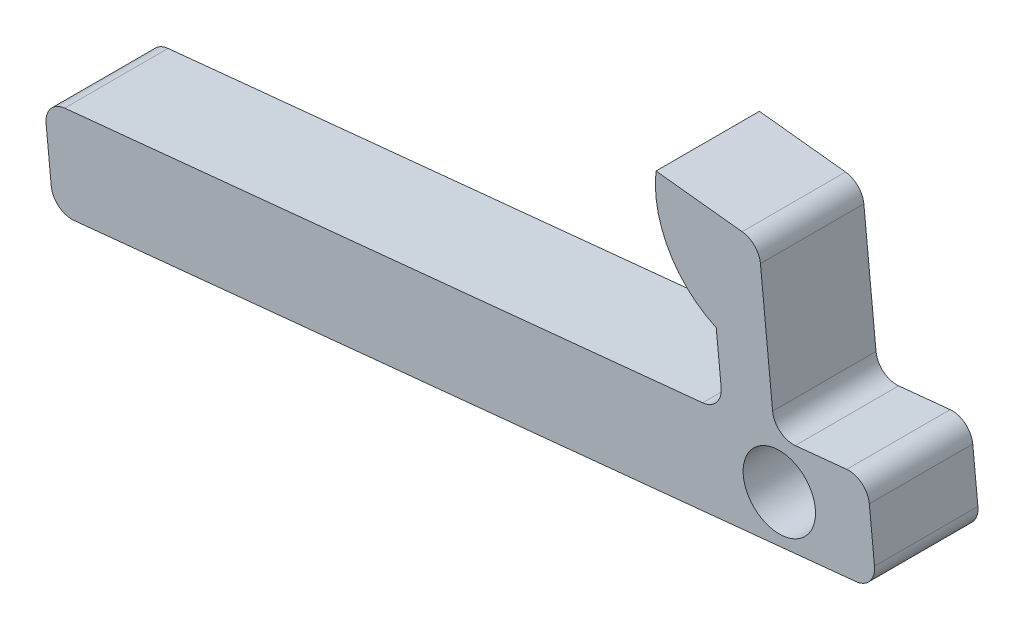
ISO-10303-21;
HEADER;
FILE_DESCRIPTION(('STEP AP214'),'2;1');
FILE_NAME('part.step','',(''),(''),'','','');
FILE_SCHEMA(('AUTOMOTIVE_DESIGN { 1 0 10303 214 1 1 1 1 }'));
ENDSEC;
DATA;
#1=APPLICATION_CONTEXT('core data for automotive mechanical design processes');
#2=APPLICATION_PROTOCOL_DEFINITION('international standard','automotive_design',2000,#1);
#3=PRODUCT_CONTEXT('',#1,'mechanical');
#4=PRODUCT('Part','Part','',(#3));
#5=PRODUCT_RELATED_PRODUCT_CATEGORY('part','',(#4));
#6=PRODUCT_DEFINITION_FORMATION('','',#4);
#7=PRODUCT_DEFINITION_CONTEXT('part definition',#1,'design');
#8=PRODUCT_DEFINITION('design','',#6,#7);
#9=PRODUCT_DEFINITION_SHAPE('','',#8);
#10=(LENGTH_UNIT() NAMED_UNIT(*) SI_UNIT(.MILLI.,.METRE.));
#11=(NAMED_UNIT(*) PLANE_ANGLE_UNIT() SI_UNIT($,.RADIAN.));
#12=(NAMED_UNIT(*) SI_UNIT($,.STERADIAN.) SOLID_ANGLE_UNIT());
#13=UNCERTAINTY_MEASURE_WITH_UNIT(LENGTH_MEASURE(1.E-05),#10,'distance_accuracy_value','');
#14=(GEOMETRIC_REPRESENTATION_CONTEXT(3) GLOBAL_UNCERTAINTY_ASSIGNED_CONTEXT((#13)) GLOBAL_UNIT_ASSIGNED_CONTEXT((#10,
#11,#12)) REPRESENTATION_CONTEXT('',''));
#15=CARTESIAN_POINT('',(0.,0.,0.));
#16=DIRECTION('',(0.,0.,1.));
#17=DIRECTION('',(1.,0.,0.));
#18=AXIS2_PLACEMENT_3D('',#15,#16,#17);
#19=CARTESIAN_POINT('',(56.2046901108476,51.9259083552137,10.));
#20=DIRECTION('',(0.,0.,1.));
#21=DIRECTION('',(1.,0.,0.));
#22=AXIS2_PLACEMENT_3D('',#19,#20,#21);
#23=PLANE('',#22);
#24=DIRECTION('',(0.0995037190210134,-0.995037190209988,0.));
#25=VECTOR('',#24,1.);
#26=CARTESIAN_POINT('',(-12.9065685656067,29.4973260201751,10.));
#27=LINE('',#26,#25);
#28=CARTESIAN_POINT('',(-12.7075611275646,27.5072516397551,10.));
#29=VERTEX_POINT('',#28);
#30=CARTESIAN_POINT('',(-12.2100425324596,22.5320656887051,10.));
#31=VERTEX_POINT('',#30);
#32=EDGE_CURVE('E252',#29,#31,#27,.T.);
#33=ORIENTED_EDGE('',*,*,#32,.T.);
#34=CARTESIAN_POINT('',(-10.2199681520396,22.7310731267472,10.));
#35=DIRECTION('',(0.,0.,1.));
#36=DIRECTION('',(1.,0.,0.));
#37=AXIS2_PLACEMENT_3D('',#34,#35,#36);
#38=CIRCLE('',#37,2.);
#39=CARTESIAN_POINT('',(-10.0209607139976,20.7409987463272,10.));
#40=VERTEX_POINT('',#39);
#41=EDGE_CURVE('E50',#31,#40,#38,.T.);
#42=ORIENTED_EDGE('',*,*,#41,.T.);
#43=DIRECTION('',(0.995037190209988,0.0995037190210137,0.));
#44=VECTOR('',#43,1.);
#45=CARTESIAN_POINT('',(-12.0110350944175,20.5419913082852,10.));
#46=LINE('',#45,#44);
#47=CARTESIAN_POINT('',(65.6018657419615,28.3032813919242,10.));
#48=VERTEX_POINT('',#47);
#49=EDGE_CURVE('E249',#40,#48,#46,.T.);
#50=ORIENTED_EDGE('',*,*,#49,.T.);
#51=CARTESIAN_POINT('',(65.4028583039195,30.2933557723442,10.));
#52=DIRECTION('',(0.,0.,1.));
#53=DIRECTION('',(1.,0.,0.));
#54=AXIS2_PLACEMENT_3D('',#51,#52,#53);
#55=CIRCLE('',#54,2.);
#56=CARTESIAN_POINT('',(67.3929326843394,30.4923632103862,10.));
#57=VERTEX_POINT('',#56);
#58=EDGE_CURVE('E206',#48,#57,#55,.T.);
#59=ORIENTED_EDGE('',*,*,#58,.T.);
#60=DIRECTION('',(-0.0995037190210138,0.995037190209988,0.));
#61=VECTOR('',#60,1.);
#62=CARTESIAN_POINT('',(66.6964066511923,37.4576235418561,10.));
#63=LINE('',#62,#61);
#64=CARTESIAN_POINT('',(66.8954140892344,35.4675491614361,10.));
#65=VERTEX_POINT('',#64);
#66=EDGE_CURVE('E258',#57,#65,#63,.T.);
#67=ORIENTED_EDGE('',*,*,#66,.T.);
#68=CARTESIAN_POINT('',(64.9053397088144,35.2685417233941,10.));
#69=DIRECTION('',(0.,0.,1.));
#70=DIRECTION('',(1.,0.,0.));
#71=AXIS2_PLACEMENT_3D('',#68,#69,#70);
#72=CIRCLE('',#71,2.);
#73=CARTESIAN_POINT('',(64.7063322707724,37.2586161038141,10.));
#74=VERTEX_POINT('',#73);
#75=EDGE_CURVE('E207',#65,#74,#72,.T.);
#76=ORIENTED_EDGE('',*,*,#75,.T.);
#77=DIRECTION('',(-0.995037190209988,-0.0995037190210148,0.));
#78=VECTOR('',#77,1.);
#79=CARTESIAN_POINT('',(57.7410719393025,36.562090070667,10.));
#80=LINE('',#79,#78);
#81=CARTESIAN_POINT('',(59.7311463197224,36.761097508709,10.));
#82=VERTEX_POINT('',#81);
#83=EDGE_CURVE('E296',#74,#82,#80,.T.);
#84=ORIENTED_EDGE('',*,*,#83,.T.);
#85=CARTESIAN_POINT('',(59.5321388816804,38.751171889129,10.));
#86=DIRECTION('',(0.,0.,1.));
#87=DIRECTION('',(1.,0.,0.));
#88=AXIS2_PLACEMENT_3D('',#85,#86,#87);
#89=CIRCLE('',#88,2.);
#90=CARTESIAN_POINT('',(57.5420645012604,38.5521644510869,10.));
#91=VERTEX_POINT('',#90);
#92=EDGE_CURVE('E230',#82,#91,#89,.F.);
#93=ORIENTED_EDGE('',*,*,#92,.T.);
#94=DIRECTION('',(-0.0995037190210135,0.995037190209988,0.));
#95=VECTOR('',#94,1.);
#96=CARTESIAN_POINT('',(57.7410719393025,36.562090070667,10.));
#97=LINE('',#96,#95);
#98=CARTESIAN_POINT('',(56.3658651346012,50.3141581176775,10.));
#99=VERTEX_POINT('',#98);
#100=EDGE_CURVE('E294',#91,#99,#97,.T.);
#101=ORIENTED_EDGE('',*,*,#100,.T.);
#102=CARTESIAN_POINT('',(54.3757907541812,50.1151506796355,10.));
#103=DIRECTION('',(0.,0.,1.));
#104=DIRECTION('',(1.,0.,0.));
#105=AXIS2_PLACEMENT_3D('',#102,#103,#104);
#106=CIRCLE('',#105,2.);
#107=CARTESIAN_POINT('',(54.5946266554137,52.1031423416733,10.));
#108=VERTEX_POINT('',#107);
#109=EDGE_CURVE('E201',#99,#108,#106,.T.);
#110=ORIENTED_EDGE('',*,*,#109,.T.);
#111=DIRECTION('',(-0.993995831018897,0.109417950616217,0.));
#112=VECTOR('',#111,1.);
#113=CARTESIAN_POINT('',(56.2046901108476,51.9259083552137,10.));
#114=LINE('',#113,#112);
#115=CARTESIAN_POINT('',(46.2647318006586,53.0200878613759,10.));
#116=VERTEX_POINT('',#115);
#117=EDGE_CURVE('E171',#108,#116,#114,.T.);
#118=ORIENTED_EDGE('',*,*,#117,.T.);
#119=CARTESIAN_POINT('',(56.2046901108476,51.9259083552137,10.));
#120=DIRECTION('',(0.,0.,1.));
#121=DIRECTION('',(1.,0.,0.));
#122=AXIS2_PLACEMENT_3D('',#119,#120,#121);
#123=CIRCLE('',#122,10.);
#124=CARTESIAN_POINT('',(52.0912316442299,42.8111149157873,10.));
#125=VERTEX_POINT('',#124);
#126=EDGE_CURVE('E168',#116,#125,#123,.T.);
#127=ORIENTED_EDGE('',*,*,#126,.T.);
#128=DIRECTION('',(0.0995037190210143,-0.995037190209988,0.));
#129=VECTOR('',#128,1.);
#130=CARTESIAN_POINT('',(52.7658859882525,36.0645714755619,10.));
#131=LINE('',#130,#129);
#132=CARTESIAN_POINT('',(52.5668785502105,38.0546458559819,10.));
#133=VERTEX_POINT('',#132);
#134=EDGE_CURVE('E151',#125,#133,#131,.T.);
#135=ORIENTED_EDGE('',*,*,#134,.T.);
#136=CARTESIAN_POINT('',(50.5768041697905,37.8556384179399,10.));
#137=DIRECTION('',(0.,0.,1.));
#138=DIRECTION('',(1.,0.,0.));
#139=AXIS2_PLACEMENT_3D('',#136,#137,#138);
#140=CIRCLE('',#139,2.);
#141=CARTESIAN_POINT('',(50.7758116078325,35.8655640375199,10.));
#142=VERTEX_POINT('',#141);
#143=EDGE_CURVE('E224',#133,#142,#140,.F.);
#144=ORIENTED_EDGE('',*,*,#143,.T.);
#145=DIRECTION('',(-0.995037190209988,-0.0995037190210135,0.));
#146=VECTOR('',#145,1.);
#147=CARTESIAN_POINT('',(-12.9065685656067,29.4973260201751,10.));
#148=LINE('',#147,#146);
#149=CARTESIAN_POINT('',(-10.9164941851867,29.6963334582171,10.));
#150=VERTEX_POINT('',#149);
#151=EDGE_CURVE('E164',#142,#150,#148,.T.);
#152=ORIENTED_EDGE('',*,*,#151,.T.);
#153=CARTESIAN_POINT('',(-10.7174867471447,27.7062590777971,10.));
#154=DIRECTION('',(0.,0.,1.));
#155=DIRECTION('',(1.,0.,0.));
#156=AXIS2_PLACEMENT_3D('',#153,#154,#155);
#157=CIRCLE('',#156,2.);
#158=EDGE_CURVE('E250',#150,#29,#157,.T.);
#159=ORIENTED_EDGE('',*,*,#158,.T.);
#160=EDGE_LOOP('',(#33,#42,#50,#59,#67,#76,#84,#93,#101,#110,#118,#127,#135,#144,#152,#159));
#161=FACE_BOUND('',#160,.T.);
#162=CARTESIAN_POINT('',(58.188838674897,32.0844227147221,10.));
#163=DIRECTION('',(0.,0.,1.));
#164=DIRECTION('',(1.,0.,0.));
#165=AXIS2_PLACEMENT_3D('',#162,#163,#164);
#166=CIRCLE('',#165,3.5);
#167=CARTESIAN_POINT('',(61.688838674897,32.0844227147221,10.));
#168=VERTEX_POINT('',#167);
#169=EDGE_CURVE('E287',#168,#168,#166,.T.);
#170=ORIENTED_EDGE('',*,*,#169,.F.);
#171=EDGE_LOOP('',(#170));
#172=FACE_BOUND('',#171,.T.);
#173=ADVANCED_FACE('F39',(#161,#172),#23,.T.);
#174=CARTESIAN_POINT('',(56.2046901108476,51.9259083552137,0.));
#175=DIRECTION('',(0.,0.,1.));
#176=DIRECTION('',(1.,0.,0.));
#177=AXIS2_PLACEMENT_3D('',#174,#175,#176);
#178=PLANE('',#177);
#179=DIRECTION('',(0.995037190209988,0.0995037190210139,0.));
#180=VECTOR('',#179,1.);
#181=CARTESIAN_POINT('',(58.6366054104913,27.6067553587771,0.));
#182=LINE('',#181,#180);
#183=CARTESIAN_POINT('',(-10.0209607139976,20.7409987463272,0.));
#184=VERTEX_POINT('',#183);
#185=CARTESIAN_POINT('',(65.6018657419615,28.3032813919242,0.));
#186=VERTEX_POINT('',#185);
#187=EDGE_CURVE('E270',#184,#186,#182,.T.);
#188=ORIENTED_EDGE('',*,*,#187,.F.);
#189=CARTESIAN_POINT('',(-10.2199681520396,22.7310731267472,0.));
#190=DIRECTION('',(0.,0.,1.));
#191=DIRECTION('',(1.,0.,0.));
#192=AXIS2_PLACEMENT_3D('',#189,#190,#191);
#193=CIRCLE('',#192,2.);
#194=CARTESIAN_POINT('',(-12.2100425324596,22.5320656887051,0.));
#195=VERTEX_POINT('',#194);
#196=EDGE_CURVE('E241',#184,#195,#193,.F.);
#197=ORIENTED_EDGE('',*,*,#196,.T.);
#198=DIRECTION('',(0.0995037190210134,-0.995037190209988,0.));
#199=VECTOR('',#198,1.);
#200=CARTESIAN_POINT('',(-12.9065685656067,29.4973260201751,0.));
#201=LINE('',#200,#199);
#202=CARTESIAN_POINT('',(-12.7075611275646,27.5072516397551,0.));
#203=VERTEX_POINT('',#202);
#204=EDGE_CURVE('E267',#203,#195,#201,.T.);
#205=ORIENTED_EDGE('',*,*,#204,.F.);
#206=CARTESIAN_POINT('',(-10.7174867471447,27.7062590777971,0.));
#207=DIRECTION('',(0.,0.,1.));
#208=DIRECTION('',(1.,0.,0.));
#209=AXIS2_PLACEMENT_3D('',#206,#207,#208);
#210=CIRCLE('',#209,2.);
#211=CARTESIAN_POINT('',(-10.9164941851867,29.6963334582171,0.));
#212=VERTEX_POINT('',#211);
#213=EDGE_CURVE('E237',#203,#212,#210,.F.);
#214=ORIENTED_EDGE('',*,*,#213,.T.);
#215=DIRECTION('',(-0.995037190209988,-0.0995037190210135,0.));
#216=VECTOR('',#215,1.);
#217=CARTESIAN_POINT('',(-12.9065685656067,29.4973260201751,0.));
#218=LINE('',#217,#216);
#219=CARTESIAN_POINT('',(50.7758116078325,35.8655640375199,0.));
#220=VERTEX_POINT('',#219);
#221=EDGE_CURVE('E268',#220,#212,#218,.T.);
#222=ORIENTED_EDGE('',*,*,#221,.F.);
#223=CARTESIAN_POINT('',(50.5768041697905,37.8556384179399,0.));
#224=DIRECTION('',(0.,0.,1.));
#225=DIRECTION('',(1.,0.,0.));
#226=AXIS2_PLACEMENT_3D('',#223,#224,#225);
#227=CIRCLE('',#226,2.);
#228=CARTESIAN_POINT('',(52.5668785502105,38.0546458559819,0.));
#229=VERTEX_POINT('',#228);
#230=EDGE_CURVE('E223',#220,#229,#227,.T.);
#231=ORIENTED_EDGE('',*,*,#230,.T.);
#232=DIRECTION('',(0.0995037190210143,-0.995037190209988,0.));
#233=VECTOR('',#232,1.);
#234=CARTESIAN_POINT('',(52.7658859882525,36.0645714755619,0.));
#235=LINE('',#234,#233);
#236=CARTESIAN_POINT('',(52.0912316442299,42.8111149157873,0.));
#237=VERTEX_POINT('',#236);
#238=EDGE_CURVE('E274',#237,#229,#235,.T.);
#239=ORIENTED_EDGE('',*,*,#238,.F.);
#240=CARTESIAN_POINT('',(56.2046901108476,51.9259083552137,0.));
#241=DIRECTION('',(0.,0.,1.));
#242=DIRECTION('',(1.,0.,0.));
#243=AXIS2_PLACEMENT_3D('',#240,#241,#242);
#244=CIRCLE('',#243,10.);
#245=CARTESIAN_POINT('',(46.2647318006586,53.0200878613759,0.));
#246=VERTEX_POINT('',#245);
#247=EDGE_CURVE('E177',#246,#237,#244,.T.);
#248=ORIENTED_EDGE('',*,*,#247,.F.);
#249=DIRECTION('',(-0.993995831018897,0.109417950616217,0.));
#250=VECTOR('',#249,1.);
#251=CARTESIAN_POINT('',(56.2046901108476,51.9259083552137,0.));
#252=LINE('',#251,#250);
#253=CARTESIAN_POINT('',(54.5946266554137,52.1031423416733,0.));
#254=VERTEX_POINT('',#253);
#255=EDGE_CURVE('E174',#254,#246,#252,.T.);
#256=ORIENTED_EDGE('',*,*,#255,.F.);
#257=CARTESIAN_POINT('',(54.3757907541812,50.1151506796355,0.));
#258=DIRECTION('',(0.,0.,1.));
#259=DIRECTION('',(1.,0.,0.));
#260=AXIS2_PLACEMENT_3D('',#257,#258,#259);
#261=CIRCLE('',#260,2.);
#262=CARTESIAN_POINT('',(56.3658651346012,50.3141581176775,0.));
#263=VERTEX_POINT('',#262);
#264=EDGE_CURVE('E193',#254,#263,#261,.F.);
#265=ORIENTED_EDGE('',*,*,#264,.T.);
#266=DIRECTION('',(-0.0995037190210135,0.995037190209988,0.));
#267=VECTOR('',#266,1.);
#268=CARTESIAN_POINT('',(57.7410719393025,36.562090070667,0.));
#269=LINE('',#268,#267);
#270=CARTESIAN_POINT('',(57.5420645012604,38.5521644510869,0.));
#271=VERTEX_POINT('',#270);
#272=EDGE_CURVE('E284',#271,#263,#269,.T.);
#273=ORIENTED_EDGE('',*,*,#272,.F.);
#274=CARTESIAN_POINT('',(59.5321388816804,38.751171889129,0.));
#275=DIRECTION('',(0.,0.,1.));
#276=DIRECTION('',(1.,0.,0.));
#277=AXIS2_PLACEMENT_3D('',#274,#275,#276);
#278=CIRCLE('',#277,2.);
#279=CARTESIAN_POINT('',(59.7311463197224,36.761097508709,0.));
#280=VERTEX_POINT('',#279);
#281=EDGE_CURVE('E227',#271,#280,#278,.T.);
#282=ORIENTED_EDGE('',*,*,#281,.T.);
#283=DIRECTION('',(-0.995037190209988,-0.0995037190210148,0.));
#284=VECTOR('',#283,1.);
#285=CARTESIAN_POINT('',(57.7410719393025,36.562090070667,0.));
#286=LINE('',#285,#284);
#287=CARTESIAN_POINT('',(64.7063322707724,37.2586161038141,0.));
#288=VERTEX_POINT('',#287);
#289=EDGE_CURVE('E277',#288,#280,#286,.T.);
#290=ORIENTED_EDGE('',*,*,#289,.F.);
#291=CARTESIAN_POINT('',(64.9053397088144,35.2685417233941,0.));
#292=DIRECTION('',(0.,0.,1.));
#293=DIRECTION('',(1.,0.,0.));
#294=AXIS2_PLACEMENT_3D('',#291,#292,#293);
#295=CIRCLE('',#294,2.);
#296=CARTESIAN_POINT('',(66.8954140892344,35.4675491614361,0.));
#297=VERTEX_POINT('',#296);
#298=EDGE_CURVE('E197',#288,#297,#295,.F.);
#299=ORIENTED_EDGE('',*,*,#298,.T.);
#300=DIRECTION('',(-0.0995037190210138,0.995037190209988,0.));
#301=VECTOR('',#300,1.);
#302=CARTESIAN_POINT('',(66.6964066511923,37.4576235418561,0.));
#303=LINE('',#302,#301);
#304=CARTESIAN_POINT('',(67.3929326843394,30.4923632103862,0.));
#305=VERTEX_POINT('',#304);
#306=EDGE_CURVE('E275',#305,#297,#303,.T.);
#307=ORIENTED_EDGE('',*,*,#306,.F.);
#308=CARTESIAN_POINT('',(65.4028583039195,30.2933557723442,0.));
#309=DIRECTION('',(0.,0.,1.));
#310=DIRECTION('',(1.,0.,0.));
#311=AXIS2_PLACEMENT_3D('',#308,#309,#310);
#312=CIRCLE('',#311,2.);
#313=EDGE_CURVE('E199',#305,#186,#312,.F.);
#314=ORIENTED_EDGE('',*,*,#313,.T.);
#315=EDGE_LOOP('',(#188,#197,#205,#214,#222,#231,#239,#248,#256,#265,#273,#282,#290,#299,#307,#314));
#316=FACE_BOUND('',#315,.T.);
#317=CARTESIAN_POINT('',(58.188838674897,32.0844227147221,0.));
#318=DIRECTION('',(0.,0.,1.));
#319=DIRECTION('',(1.,0.,0.));
#320=AXIS2_PLACEMENT_3D('',#317,#318,#319);
#321=CIRCLE('',#320,3.5);
#322=CARTESIAN_POINT('',(61.688838674897,32.0844227147221,0.));
#323=VERTEX_POINT('',#322);
#324=EDGE_CURVE('E232',#323,#323,#321,.T.);
#325=ORIENTED_EDGE('',*,*,#324,.T.);
#326=EDGE_LOOP('',(#325));
#327=FACE_BOUND('',#326,.T.);
#328=ADVANCED_FACE('F261',(#316,#327),#178,.F.);
#329=CARTESIAN_POINT('',(56.2046901108476,51.9259083552137,10.));
#330=DIRECTION('',(0.,0.,-1.));
#331=DIRECTION('',(-1.,0.,0.));
#332=AXIS2_PLACEMENT_3D('',#329,#330,#331);
#333=CYLINDRICAL_SURFACE('',#332,10.);
#334=ORIENTED_EDGE('',*,*,#247,.T.);
#335=DIRECTION('',(0.,0.,-1.));
#336=VECTOR('',#335,1.);
#337=CARTESIAN_POINT('',(52.0912316442299,42.8111149157873,10.));
#338=LINE('',#337,#336);
#339=EDGE_CURVE('E157',#125,#237,#338,.T.);
#340=ORIENTED_EDGE('',*,*,#339,.F.);
#341=ORIENTED_EDGE('',*,*,#126,.F.);
#342=DIRECTION('',(0.,0.,-1.));
#343=VECTOR('',#342,1.);
#344=CARTESIAN_POINT('',(46.2647318006586,53.0200878613759,10.));
#345=LINE('',#344,#343);
#346=EDGE_CURVE('E181',#116,#246,#345,.T.);
#347=ORIENTED_EDGE('',*,*,#346,.T.);
#348=EDGE_LOOP('',(#334,#340,#341,#347));
#349=FACE_BOUND('',#348,.T.);
#350=ADVANCED_FACE('F180',(#349),#333,.T.);
#351=CARTESIAN_POINT('',(52.7658859882525,36.0645714755619,10.));
#352=DIRECTION('',(0.995037190209988,0.0995037190210143,0.));
#353=DIRECTION('',(-0.0995037190210143,0.995037190209988,0.));
#354=AXIS2_PLACEMENT_3D('',#351,#352,#353);
#355=PLANE('',#354);
#356=ORIENTED_EDGE('',*,*,#238,.T.);
#357=DIRECTION('',(0.,0.,-1.));
#358=VECTOR('',#357,1.);
#359=CARTESIAN_POINT('',(52.5668785502105,38.0546458559819,10.));
#360=LINE('',#359,#358);
#361=EDGE_CURVE('E162',#229,#133,#360,.F.);
#362=ORIENTED_EDGE('',*,*,#361,.T.);
#363=ORIENTED_EDGE('',*,*,#134,.F.);
#364=ORIENTED_EDGE('',*,*,#339,.T.);
#365=EDGE_LOOP('',(#356,#362,#363,#364));
#366=FACE_BOUND('',#365,.T.);
#367=ADVANCED_FACE('F160',(#366),#355,.F.);
#368=CARTESIAN_POINT('',(-12.9065685656067,29.4973260201751,10.));
#369=DIRECTION('',(0.0995037190210135,-0.995037190209988,0.));
#370=DIRECTION('',(0.995037190209988,0.0995037190210135,0.));
#371=AXIS2_PLACEMENT_3D('',#368,#369,#370);
#372=PLANE('',#371);
#373=ORIENTED_EDGE('',*,*,#221,.T.);
#374=DIRECTION('',(0.,0.,-1.));
#375=VECTOR('',#374,1.);
#376=CARTESIAN_POINT('',(-10.9164941851867,29.6963334582171,10.));
#377=LINE('',#376,#375);
#378=EDGE_CURVE('E11',#212,#150,#377,.F.);
#379=ORIENTED_EDGE('',*,*,#378,.T.);
#380=ORIENTED_EDGE('',*,*,#151,.F.);
#381=DIRECTION('',(0.,0.,-1.));
#382=VECTOR('',#381,1.);
#383=CARTESIAN_POINT('',(50.7758116078325,35.8655640375199,0.));
#384=LINE('',#383,#382);
#385=EDGE_CURVE('E179',#142,#220,#384,.T.);
#386=ORIENTED_EDGE('',*,*,#385,.T.);
#387=EDGE_LOOP('',(#373,#379,#380,#386));
#388=FACE_BOUND('',#387,.T.);
#389=ADVANCED_FACE('F348',(#388),#372,.F.);
#390=CARTESIAN_POINT('',(-12.9065685656067,29.4973260201751,10.));
#391=DIRECTION('',(0.995037190209988,0.0995037190210134,0.));
#392=DIRECTION('',(-0.0995037190210134,0.995037190209988,0.));
#393=AXIS2_PLACEMENT_3D('',#390,#391,#392);
#394=PLANE('',#393);
#395=ORIENTED_EDGE('',*,*,#204,.T.);
#396=DIRECTION('',(0.,0.,-1.));
#397=VECTOR('',#396,1.);
#398=CARTESIAN_POINT('',(-12.2100425324596,22.5320656887051,10.));
#399=LINE('',#398,#397);
#400=EDGE_CURVE('E58',#195,#31,#399,.F.);
#401=ORIENTED_EDGE('',*,*,#400,.T.);
#402=ORIENTED_EDGE('',*,*,#32,.F.);
#403=DIRECTION('',(0.,0.,-1.));
#404=VECTOR('',#403,1.);
#405=CARTESIAN_POINT('',(-12.7075611275646,27.5072516397551,10.));
#406=LINE('',#405,#404);
#407=EDGE_CURVE('E243',#29,#203,#406,.T.);
#408=ORIENTED_EDGE('',*,*,#407,.T.);
#409=EDGE_LOOP('',(#395,#401,#402,#408));
#410=FACE_BOUND('',#409,.T.);
#411=ADVANCED_FACE('F269',(#410),#394,.F.);
#412=CARTESIAN_POINT('',(58.6366054104913,27.6067553587771,10.));
#413=DIRECTION('',(-0.0995037190210139,0.995037190209988,0.));
#414=DIRECTION('',(-0.995037190209988,-0.0995037190210139,0.));
#415=AXIS2_PLACEMENT_3D('',#412,#413,#414);
#416=PLANE('',#415);
#417=CARTESIAN_POINT('',(4.2950666035441,22.1726014780816,5.00000000000003));
#418=DIRECTION('',(-0.0995037190210139,0.995037190209988,0.));
#419=DIRECTION('',(-0.995037190209988,-0.0995037190210139,0.));
#420=AXIS2_PLACEMENT_3D('',#417,#418,#419);
#421=ELLIPSE('',#420,4.5224440295044,4.5);
#422=CARTESIAN_POINT('',(-0.204933396455893,21.7226014780815,5.00000000000003));
#423=VERTEX_POINT('',#422);
#424=EDGE_CURVE('E235',#423,#423,#421,.F.);
#425=ORIENTED_EDGE('',*,*,#424,.F.);
#426=EDGE_LOOP('',(#425));
#427=FACE_BOUND('',#426,.T.);
#428=ORIENTED_EDGE('',*,*,#49,.F.);
#429=DIRECTION('',(0.,0.,-1.));
#430=VECTOR('',#429,1.);
#431=CARTESIAN_POINT('',(-10.0209607139976,20.7409987463272,10.));
#432=LINE('',#431,#430);
#433=EDGE_CURVE('E233',#40,#184,#432,.T.);
#434=ORIENTED_EDGE('',*,*,#433,.T.);
#435=ORIENTED_EDGE('',*,*,#187,.T.);
#436=DIRECTION('',(0.,0.,-1.));
#437=VECTOR('',#436,1.);
#438=CARTESIAN_POINT('',(65.6018657419615,28.3032813919242,10.));
#439=LINE('',#438,#437);
#440=EDGE_CURVE('E202',#186,#48,#439,.F.);
#441=ORIENTED_EDGE('',*,*,#440,.T.);
#442=EDGE_LOOP('',(#428,#434,#435,#441));
#443=FACE_BOUND('',#442,.T.);
#444=ADVANCED_FACE('F253',(#427,#443),#416,.F.);
#445=CARTESIAN_POINT('',(66.6964066511923,37.4576235418561,10.));
#446=DIRECTION('',(-0.995037190209988,-0.0995037190210138,0.));
#447=DIRECTION('',(0.0995037190210138,-0.995037190209988,0.));
#448=AXIS2_PLACEMENT_3D('',#445,#446,#447);
#449=PLANE('',#448);
#450=ORIENTED_EDGE('',*,*,#66,.F.);
#451=DIRECTION('',(0.,0.,-1.));
#452=VECTOR('',#451,1.);
#453=CARTESIAN_POINT('',(67.3929326843394,30.4923632103862,10.));
#454=LINE('',#453,#452);
#455=EDGE_CURVE('E194',#57,#305,#454,.T.);
#456=ORIENTED_EDGE('',*,*,#455,.T.);
#457=ORIENTED_EDGE('',*,*,#306,.T.);
#458=DIRECTION('',(0.,0.,-1.));
#459=VECTOR('',#458,1.);
#460=CARTESIAN_POINT('',(66.8954140892344,35.4675491614361,10.));
#461=LINE('',#460,#459);
#462=EDGE_CURVE('E186',#297,#65,#461,.F.);
#463=ORIENTED_EDGE('',*,*,#462,.T.);
#464=EDGE_LOOP('',(#450,#456,#457,#463));
#465=FACE_BOUND('',#464,.T.);
#466=ADVANCED_FACE('F338',(#465),#449,.F.);
#467=CARTESIAN_POINT('',(57.7410719393025,36.562090070667,10.));
#468=DIRECTION('',(0.0995037190210148,-0.995037190209988,0.));
#469=DIRECTION('',(0.995037190209987,0.0995037190210148,0.));
#470=AXIS2_PLACEMENT_3D('',#467,#468,#469);
#471=PLANE('',#470);
#472=ORIENTED_EDGE('',*,*,#83,.F.);
#473=DIRECTION('',(0.,0.,-1.));
#474=VECTOR('',#473,1.);
#475=CARTESIAN_POINT('',(64.7063322707724,37.2586161038141,10.));
#476=LINE('',#475,#474);
#477=EDGE_CURVE('E211',#74,#288,#476,.T.);
#478=ORIENTED_EDGE('',*,*,#477,.T.);
#479=ORIENTED_EDGE('',*,*,#289,.T.);
#480=DIRECTION('',(0.,0.,-1.));
#481=VECTOR('',#480,1.);
#482=CARTESIAN_POINT('',(59.7311463197224,36.761097508709,10.));
#483=LINE('',#482,#481);
#484=EDGE_CURVE('E208',#280,#82,#483,.F.);
#485=ORIENTED_EDGE('',*,*,#484,.T.);
#486=EDGE_LOOP('',(#472,#478,#479,#485));
#487=FACE_BOUND('',#486,.T.);
#488=ADVANCED_FACE('F337',(#487),#471,.F.);
#489=CARTESIAN_POINT('',(57.7410719393025,36.562090070667,10.));
#490=DIRECTION('',(-0.995037190209988,-0.0995037190210135,0.));
#491=DIRECTION('',(0.0995037190210135,-0.995037190209988,0.));
#492=AXIS2_PLACEMENT_3D('',#489,#490,#491);
#493=PLANE('',#492);
#494=ORIENTED_EDGE('',*,*,#100,.F.);
#495=DIRECTION('',(0.,0.,-1.));
#496=VECTOR('',#495,1.);
#497=CARTESIAN_POINT('',(57.5420645012604,38.5521644510869,0.));
#498=LINE('',#497,#496);
#499=EDGE_CURVE('E220',#91,#271,#498,.T.);
#500=ORIENTED_EDGE('',*,*,#499,.T.);
#501=ORIENTED_EDGE('',*,*,#272,.T.);
#502=DIRECTION('',(0.,0.,-1.));
#503=VECTOR('',#502,1.);
#504=CARTESIAN_POINT('',(56.3658651346012,50.3141581176775,10.));
#505=LINE('',#504,#503);
#506=EDGE_CURVE('E212',#263,#99,#505,.F.);
#507=ORIENTED_EDGE('',*,*,#506,.T.);
#508=EDGE_LOOP('',(#494,#500,#501,#507));
#509=FACE_BOUND('',#508,.T.);
#510=ADVANCED_FACE('F334',(#509),#493,.F.);
#511=CARTESIAN_POINT('',(56.2046901108476,51.9259083552137,10.));
#512=DIRECTION('',(-0.109417950616217,-0.993995831018897,0.));
#513=DIRECTION('',(0.993995831018897,-0.109417950616217,0.));
#514=AXIS2_PLACEMENT_3D('',#511,#512,#513);
#515=PLANE('',#514);
#516=ORIENTED_EDGE('',*,*,#117,.F.);
#517=DIRECTION('',(0.,0.,-1.));
#518=VECTOR('',#517,1.);
#519=CARTESIAN_POINT('',(54.5946266554137,52.1031423416733,10.));
#520=LINE('',#519,#518);
#521=EDGE_CURVE('E218',#108,#254,#520,.T.);
#522=ORIENTED_EDGE('',*,*,#521,.T.);
#523=ORIENTED_EDGE('',*,*,#255,.T.);
#524=ORIENTED_EDGE('',*,*,#346,.F.);
#525=EDGE_LOOP('',(#516,#522,#523,#524));
#526=FACE_BOUND('',#525,.T.);
#527=ADVANCED_FACE('F290',(#526),#515,.F.);
#528=CARTESIAN_POINT('',(58.188838674897,32.0844227147221,10.));
#529=DIRECTION('',(0.,0.,-1.));
#530=DIRECTION('',(-1.,0.,0.));
#531=AXIS2_PLACEMENT_3D('',#528,#529,#530);
#532=CYLINDRICAL_SURFACE('',#531,3.5);
#533=ORIENTED_EDGE('',*,*,#169,.T.);
#534=EDGE_LOOP('',(#533));
#535=FACE_BOUND('',#534,.T.);
#536=ORIENTED_EDGE('',*,*,#324,.F.);
#537=EDGE_LOOP('',(#536));
#538=FACE_BOUND('',#537,.T.);
#539=ADVANCED_FACE('F326',(#535,#538),#532,.F.);
#540=CARTESIAN_POINT('',(50.5768041697905,37.8556384179399,10.));
#541=DIRECTION('',(0.,0.,1.));
#542=DIRECTION('',(1.,0.,0.));
#543=AXIS2_PLACEMENT_3D('',#540,#541,#542);
#544=CYLINDRICAL_SURFACE('',#543,2.);
#545=ORIENTED_EDGE('',*,*,#143,.F.);
#546=ORIENTED_EDGE('',*,*,#361,.F.);
#547=ORIENTED_EDGE('',*,*,#230,.F.);
#548=ORIENTED_EDGE('',*,*,#385,.F.);
#549=EDGE_LOOP('',(#545,#546,#547,#548));
#550=FACE_BOUND('',#549,.T.);
#551=ADVANCED_FACE('F357',(#550),#544,.F.);
#552=CARTESIAN_POINT('',(65.4028583039195,30.2933557723442,10.));
#553=DIRECTION('',(0.,0.,-1.));
#554=DIRECTION('',(-1.,0.,0.));
#555=AXIS2_PLACEMENT_3D('',#552,#553,#554);
#556=CYLINDRICAL_SURFACE('',#555,2.);
#557=ORIENTED_EDGE('',*,*,#58,.F.);
#558=ORIENTED_EDGE('',*,*,#440,.F.);
#559=ORIENTED_EDGE('',*,*,#313,.F.);
#560=ORIENTED_EDGE('',*,*,#455,.F.);
#561=EDGE_LOOP('',(#557,#558,#559,#560));
#562=FACE_BOUND('',#561,.T.);
#563=ADVANCED_FACE('F359',(#562),#556,.T.);
#564=CARTESIAN_POINT('',(64.9053397088144,35.2685417233941,10.));
#565=DIRECTION('',(0.,0.,-1.));
#566=DIRECTION('',(-1.,0.,0.));
#567=AXIS2_PLACEMENT_3D('',#564,#565,#566);
#568=CYLINDRICAL_SURFACE('',#567,2.);
#569=ORIENTED_EDGE('',*,*,#75,.F.);
#570=ORIENTED_EDGE('',*,*,#462,.F.);
#571=ORIENTED_EDGE('',*,*,#298,.F.);
#572=ORIENTED_EDGE('',*,*,#477,.F.);
#573=EDGE_LOOP('',(#569,#570,#571,#572));
#574=FACE_BOUND('',#573,.T.);
#575=ADVANCED_FACE('F364',(#574),#568,.T.);
#576=CARTESIAN_POINT('',(59.5321388816804,38.751171889129,10.));
#577=DIRECTION('',(0.,0.,1.));
#578=DIRECTION('',(1.,0.,0.));
#579=AXIS2_PLACEMENT_3D('',#576,#577,#578);
#580=CYLINDRICAL_SURFACE('',#579,2.);
#581=ORIENTED_EDGE('',*,*,#92,.F.);
#582=ORIENTED_EDGE('',*,*,#484,.F.);
#583=ORIENTED_EDGE('',*,*,#281,.F.);
#584=ORIENTED_EDGE('',*,*,#499,.F.);
#585=EDGE_LOOP('',(#581,#582,#583,#584));
#586=FACE_BOUND('',#585,.T.);
#587=ADVANCED_FACE('F368',(#586),#580,.F.);
#588=CARTESIAN_POINT('',(54.3757907541812,50.1151506796355,10.));
#589=DIRECTION('',(0.,0.,-1.));
#590=DIRECTION('',(-1.,0.,0.));
#591=AXIS2_PLACEMENT_3D('',#588,#589,#590);
#592=CYLINDRICAL_SURFACE('',#591,2.);
#593=ORIENTED_EDGE('',*,*,#109,.F.);
#594=ORIENTED_EDGE('',*,*,#506,.F.);
#595=ORIENTED_EDGE('',*,*,#264,.F.);
#596=ORIENTED_EDGE('',*,*,#521,.F.);
#597=EDGE_LOOP('',(#593,#594,#595,#596));
#598=FACE_BOUND('',#597,.T.);
#599=ADVANCED_FACE('F324',(#598),#592,.T.);
#600=CARTESIAN_POINT('',(4.2950666035441,26.,5.00000000000003));
#601=DIRECTION('',(0.,-1.,0.));
#602=DIRECTION('',(0.,0.,-1.));
#603=AXIS2_PLACEMENT_3D('',#600,#601,#602);
#604=CYLINDRICAL_SURFACE('',#603,4.5);
#605=CARTESIAN_POINT('',(4.2950666035441,26.,5.00000000000003));
#606=DIRECTION('',(0.,1.,0.));
#607=DIRECTION('',(0.,0.,1.));
#608=AXIS2_PLACEMENT_3D('',#605,#606,#607);
#609=CIRCLE('',#608,4.5);
#610=CARTESIAN_POINT('',(4.2950666035441,26.,9.50000000000003));
#611=VERTEX_POINT('',#610);
#612=EDGE_CURVE('E236',#611,#611,#609,.T.);
#613=ORIENTED_EDGE('',*,*,#612,.T.);
#614=EDGE_LOOP('',(#613));
#615=FACE_BOUND('',#614,.T.);
#616=ORIENTED_EDGE('',*,*,#424,.T.);
#617=EDGE_LOOP('',(#616));
#618=FACE_BOUND('',#617,.T.);
#619=ADVANCED_FACE('F309',(#615,#618),#604,.F.);
#620=CARTESIAN_POINT('',(4.2950666035441,26.,5.00000000000003));
#621=DIRECTION('',(0.,1.,0.));
#622=DIRECTION('',(0.,0.,1.));
#623=AXIS2_PLACEMENT_3D('',#620,#621,#622);
#624=PLANE('',#623);
#625=ORIENTED_EDGE('',*,*,#612,.F.);
#626=EDGE_LOOP('',(#625));
#627=FACE_BOUND('',#626,.T.);
#628=ADVANCED_FACE('F312',(#627),#624,.F.);
#629=CARTESIAN_POINT('',(-10.2199681520396,22.7310731267472,10.));
#630=DIRECTION('',(0.,0.,-1.));
#631=DIRECTION('',(-1.,0.,0.));
#632=AXIS2_PLACEMENT_3D('',#629,#630,#631);
#633=CYLINDRICAL_SURFACE('',#632,2.);
#634=ORIENTED_EDGE('',*,*,#41,.F.);
#635=ORIENTED_EDGE('',*,*,#400,.F.);
#636=ORIENTED_EDGE('',*,*,#196,.F.);
#637=ORIENTED_EDGE('',*,*,#433,.F.);
#638=EDGE_LOOP('',(#634,#635,#636,#637));
#639=FACE_BOUND('',#638,.T.);
#640=ADVANCED_FACE('F262',(#639),#633,.T.);
#641=CARTESIAN_POINT('',(-10.7174867471447,27.7062590777971,10.));
#642=DIRECTION('',(0.,0.,-1.));
#643=DIRECTION('',(-1.,0.,0.));
#644=AXIS2_PLACEMENT_3D('',#641,#642,#643);
#645=CYLINDRICAL_SURFACE('',#644,2.);
#646=ORIENTED_EDGE('',*,*,#158,.F.);
#647=ORIENTED_EDGE('',*,*,#378,.F.);
#648=ORIENTED_EDGE('',*,*,#213,.F.);
#649=ORIENTED_EDGE('',*,*,#407,.F.);
#650=EDGE_LOOP('',(#646,#647,#648,#649));
#651=FACE_BOUND('',#650,.T.);
#652=ADVANCED_FACE('F41',(#651),#645,.T.);
#653=CLOSED_SHELL('',(#173,#328,#350,#367,#389,#411,#444,#466,#488,#510,#527,#539,#551,#563,
#575,#587,#599,#619,#628,#640,#652));
#654=MANIFOLD_SOLID_BREP('B2',#653);
#655=ADVANCED_BREP_SHAPE_REPRESENTATION('',(#18,#654),#14);
#656=SHAPE_DEFINITION_REPRESENTATION(#9,#655);
ENDSEC;
END-ISO-10303-21;
